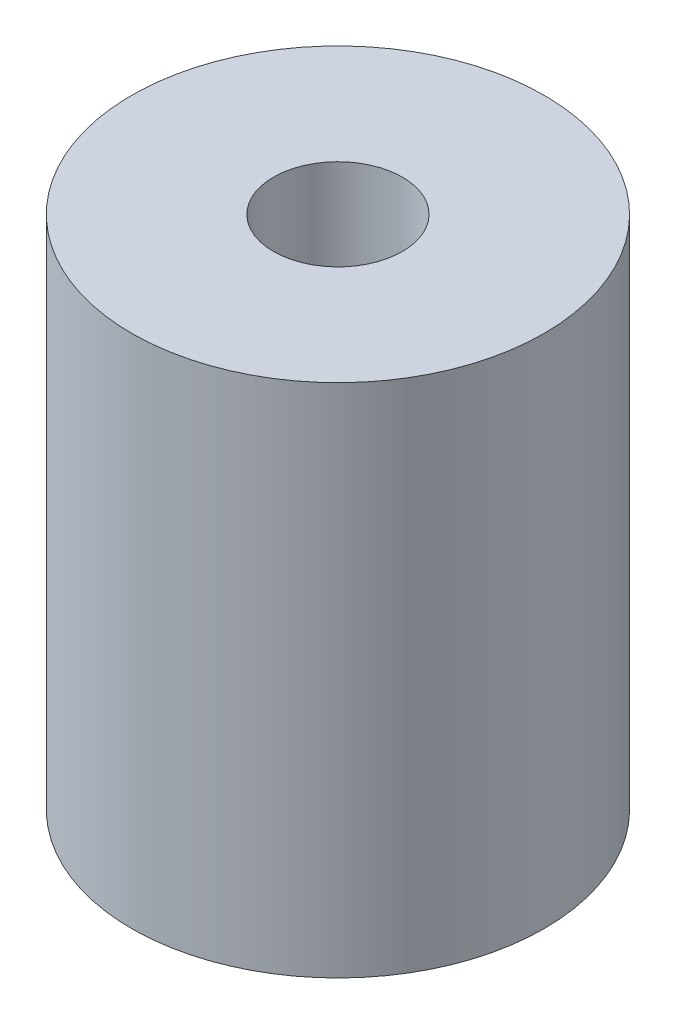
ISO-10303-21;
HEADER;
FILE_DESCRIPTION(('STEP AP214'),'2;1');
FILE_NAME('part.step','',(''),(''),'','','');
FILE_SCHEMA(('AUTOMOTIVE_DESIGN { 1 0 10303 214 1 1 1 1 }'));
ENDSEC;
DATA;
#1=APPLICATION_CONTEXT('core data for automotive mechanical design processes');
#2=APPLICATION_PROTOCOL_DEFINITION('international standard','automotive_design',2000,#1);
#3=PRODUCT_CONTEXT('',#1,'mechanical');
#4=PRODUCT('Part','Part','',(#3));
#5=PRODUCT_RELATED_PRODUCT_CATEGORY('part','',(#4));
#6=PRODUCT_DEFINITION_FORMATION('','',#4);
#7=PRODUCT_DEFINITION_CONTEXT('part definition',#1,'design');
#8=PRODUCT_DEFINITION('design','',#6,#7);
#9=PRODUCT_DEFINITION_SHAPE('','',#8);
#10=(LENGTH_UNIT() NAMED_UNIT(*) SI_UNIT(.MILLI.,.METRE.));
#11=(NAMED_UNIT(*) PLANE_ANGLE_UNIT() SI_UNIT($,.RADIAN.));
#12=(NAMED_UNIT(*) SI_UNIT($,.STERADIAN.) SOLID_ANGLE_UNIT());
#13=UNCERTAINTY_MEASURE_WITH_UNIT(LENGTH_MEASURE(1.E-05),#10,'distance_accuracy_value','');
#14=(GEOMETRIC_REPRESENTATION_CONTEXT(3) GLOBAL_UNCERTAINTY_ASSIGNED_CONTEXT((#13)) GLOBAL_UNIT_ASSIGNED_CONTEXT((#10,
#11,#12)) REPRESENTATION_CONTEXT('',''));
#15=CARTESIAN_POINT('',(0.,0.,0.));
#16=DIRECTION('',(0.,0.,1.));
#17=DIRECTION('',(1.,0.,0.));
#18=AXIS2_PLACEMENT_3D('',#15,#16,#17);
#19=CARTESIAN_POINT('',(0.,40.,0.));
#20=DIRECTION('',(0.,1.,0.));
#21=DIRECTION('',(0.,0.,1.));
#22=AXIS2_PLACEMENT_3D('',#19,#20,#21);
#23=PLANE('',#22);
#24=CARTESIAN_POINT('',(0.,40.,0.));
#25=DIRECTION('',(0.,1.,0.));
#26=DIRECTION('',(0.,0.,1.));
#27=AXIS2_PLACEMENT_3D('',#24,#25,#26);
#28=CIRCLE('',#27,5.);
#29=CARTESIAN_POINT('',(0.,40.,5.));
#30=VERTEX_POINT('',#29);
#31=EDGE_CURVE('E41',#30,#30,#28,.T.);
#32=ORIENTED_EDGE('',*,*,#31,.F.);
#33=EDGE_LOOP('',(#32));
#34=FACE_BOUND('',#33,.T.);
#35=CARTESIAN_POINT('',(0.,40.,0.));
#36=DIRECTION('',(0.,1.,0.));
#37=DIRECTION('',(1.,0.,0.));
#38=AXIS2_PLACEMENT_3D('',#35,#36,#37);
#39=CIRCLE('',#38,16.);
#40=CARTESIAN_POINT('',(16.,40.,0.));
#41=VERTEX_POINT('',#40);
#42=EDGE_CURVE('E53',#41,#41,#39,.T.);
#43=ORIENTED_EDGE('',*,*,#42,.T.);
#44=EDGE_LOOP('',(#43));
#45=FACE_BOUND('',#44,.T.);
#46=ADVANCED_FACE('F37',(#34,#45),#23,.T.);
#47=CARTESIAN_POINT('',(0.,0.,0.));
#48=DIRECTION('',(0.,1.,0.));
#49=DIRECTION('',(0.,0.,1.));
#50=AXIS2_PLACEMENT_3D('',#47,#48,#49);
#51=PLANE('',#50);
#52=CARTESIAN_POINT('',(0.,0.,0.));
#53=DIRECTION('',(0.,-1.,0.));
#54=DIRECTION('',(0.,0.,-1.));
#55=AXIS2_PLACEMENT_3D('',#52,#53,#54);
#56=CIRCLE('',#55,2.5);
#57=CARTESIAN_POINT('',(0.,0.,-2.5));
#58=VERTEX_POINT('',#57);
#59=EDGE_CURVE('E50',#58,#58,#56,.T.);
#60=ORIENTED_EDGE('',*,*,#59,.F.);
#61=EDGE_LOOP('',(#60));
#62=FACE_BOUND('',#61,.T.);
#63=CARTESIAN_POINT('',(0.,0.,0.));
#64=DIRECTION('',(0.,1.,0.));
#65=DIRECTION('',(1.,0.,0.));
#66=AXIS2_PLACEMENT_3D('',#63,#64,#65);
#67=CIRCLE('',#66,16.);
#68=CARTESIAN_POINT('',(16.,0.,0.));
#69=VERTEX_POINT('',#68);
#70=EDGE_CURVE('E56',#69,#69,#67,.T.);
#71=ORIENTED_EDGE('',*,*,#70,.F.);
#72=EDGE_LOOP('',(#71));
#73=FACE_BOUND('',#72,.T.);
#74=ADVANCED_FACE('F39',(#62,#73),#51,.F.);
#75=CARTESIAN_POINT('',(0.,10.,0.));
#76=DIRECTION('',(0.,1.,0.));
#77=DIRECTION('',(0.,0.,1.));
#78=AXIS2_PLACEMENT_3D('',#75,#76,#77);
#79=CYLINDRICAL_SURFACE('',#78,5.);
#80=CARTESIAN_POINT('',(0.,10.,0.));
#81=DIRECTION('',(0.,1.,0.));
#82=DIRECTION('',(0.,0.,1.));
#83=AXIS2_PLACEMENT_3D('',#80,#81,#82);
#84=CIRCLE('',#83,5.);
#85=CARTESIAN_POINT('',(0.,10.,5.));
#86=VERTEX_POINT('',#85);
#87=EDGE_CURVE('E11',#86,#86,#84,.T.);
#88=ORIENTED_EDGE('',*,*,#87,.F.);
#89=EDGE_LOOP('',(#88));
#90=FACE_BOUND('',#89,.T.);
#91=ORIENTED_EDGE('',*,*,#31,.T.);
#92=EDGE_LOOP('',(#91));
#93=FACE_BOUND('',#92,.T.);
#94=ADVANCED_FACE('F71',(#90,#93),#79,.F.);
#95=CARTESIAN_POINT('',(0.,10.,0.));
#96=DIRECTION('',(0.,1.,0.));
#97=DIRECTION('',(0.,0.,1.));
#98=AXIS2_PLACEMENT_3D('',#95,#96,#97);
#99=PLANE('',#98);
#100=CARTESIAN_POINT('',(0.,10.,0.));
#101=DIRECTION('',(0.,-1.,0.));
#102=DIRECTION('',(0.,0.,-1.));
#103=AXIS2_PLACEMENT_3D('',#100,#101,#102);
#104=CIRCLE('',#103,2.5);
#105=CARTESIAN_POINT('',(0.,10.,-2.5));
#106=VERTEX_POINT('',#105);
#107=EDGE_CURVE('E48',#106,#106,#104,.T.);
#108=ORIENTED_EDGE('',*,*,#107,.T.);
#109=EDGE_LOOP('',(#108));
#110=FACE_BOUND('',#109,.T.);
#111=ORIENTED_EDGE('',*,*,#87,.T.);
#112=EDGE_LOOP('',(#111));
#113=FACE_BOUND('',#112,.T.);
#114=ADVANCED_FACE('F77',(#110,#113),#99,.T.);
#115=CARTESIAN_POINT('',(0.,10.,0.));
#116=DIRECTION('',(0.,-1.,0.));
#117=DIRECTION('',(0.,0.,-1.));
#118=AXIS2_PLACEMENT_3D('',#115,#116,#117);
#119=CYLINDRICAL_SURFACE('',#118,2.5);
#120=ORIENTED_EDGE('',*,*,#107,.F.);
#121=EDGE_LOOP('',(#120));
#122=FACE_BOUND('',#121,.T.);
#123=ORIENTED_EDGE('',*,*,#59,.T.);
#124=EDGE_LOOP('',(#123));
#125=FACE_BOUND('',#124,.T.);
#126=ADVANCED_FACE('F66',(#122,#125),#119,.F.);
#127=CARTESIAN_POINT('',(0.,40.,0.));
#128=DIRECTION('',(0.,-1.,0.));
#129=DIRECTION('',(0.,0.,-1.));
#130=AXIS2_PLACEMENT_3D('',#127,#128,#129);
#131=CYLINDRICAL_SURFACE('',#130,16.);
#132=ORIENTED_EDGE('',*,*,#42,.F.);
#133=EDGE_LOOP('',(#132));
#134=FACE_BOUND('',#133,.T.);
#135=ORIENTED_EDGE('',*,*,#70,.T.);
#136=EDGE_LOOP('',(#135));
#137=FACE_BOUND('',#136,.T.);
#138=ADVANCED_FACE('F63',(#134,#137),#131,.T.);
#139=CLOSED_SHELL('',(#46,#74,#94,#114,#126,#138));
#140=MANIFOLD_SOLID_BREP('B2',#139);
#141=ADVANCED_BREP_SHAPE_REPRESENTATION('',(#18,#140),#14);
#142=SHAPE_DEFINITION_REPRESENTATION(#9,#141);
ENDSEC;
END-ISO-10303-21;
